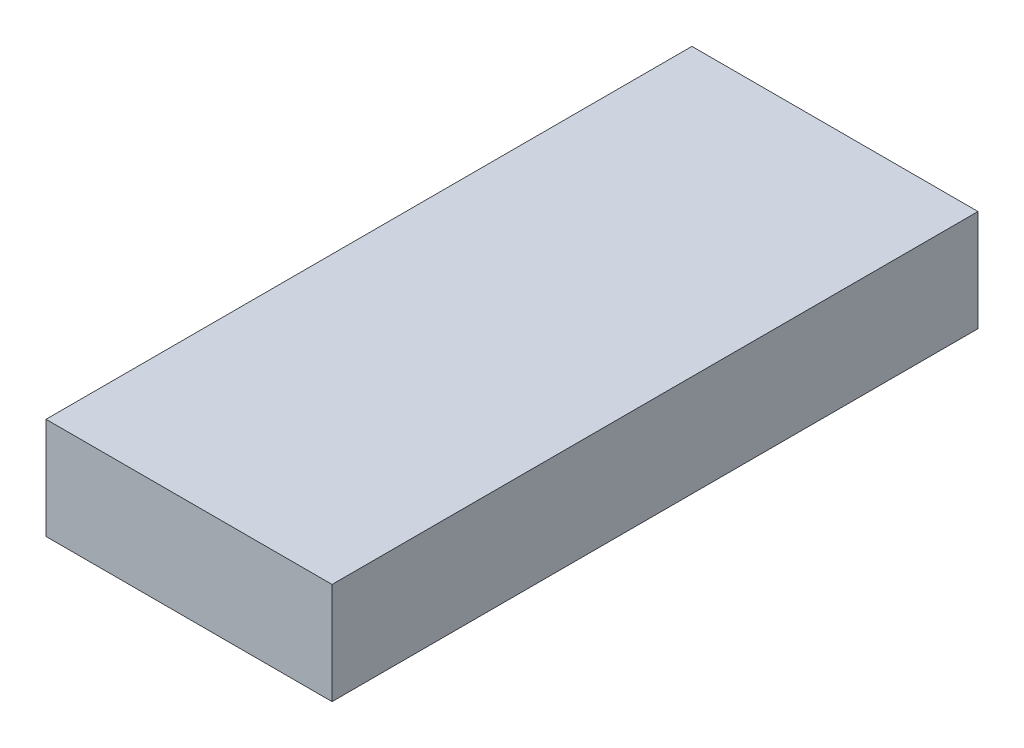
ISO-10303-21;
HEADER;
FILE_DESCRIPTION(('STEP AP214'),'2;1');
FILE_NAME('part.step','',(''),(''),'','','');
FILE_SCHEMA(('AUTOMOTIVE_DESIGN { 1 0 10303 214 1 1 1 1 }'));
ENDSEC;
DATA;
#1=APPLICATION_CONTEXT('core data for automotive mechanical design processes');
#2=APPLICATION_PROTOCOL_DEFINITION('international standard','automotive_design',2000,#1);
#3=PRODUCT_CONTEXT('',#1,'mechanical');
#4=PRODUCT('Part','Part','',(#3));
#5=PRODUCT_RELATED_PRODUCT_CATEGORY('part','',(#4));
#6=PRODUCT_DEFINITION_FORMATION('','',#4);
#7=PRODUCT_DEFINITION_CONTEXT('part definition',#1,'design');
#8=PRODUCT_DEFINITION('design','',#6,#7);
#9=PRODUCT_DEFINITION_SHAPE('','',#8);
#10=(LENGTH_UNIT() NAMED_UNIT(*) SI_UNIT(.MILLI.,.METRE.));
#11=(NAMED_UNIT(*) PLANE_ANGLE_UNIT() SI_UNIT($,.RADIAN.));
#12=(NAMED_UNIT(*) SI_UNIT($,.STERADIAN.) SOLID_ANGLE_UNIT());
#13=UNCERTAINTY_MEASURE_WITH_UNIT(LENGTH_MEASURE(1.E-05),#10,'distance_accuracy_value','');
#14=(GEOMETRIC_REPRESENTATION_CONTEXT(3) GLOBAL_UNCERTAINTY_ASSIGNED_CONTEXT((#13)) GLOBAL_UNIT_ASSIGNED_CONTEXT((#10,
#11,#12)) REPRESENTATION_CONTEXT('',''));
#15=CARTESIAN_POINT('',(0.,0.,0.));
#16=DIRECTION('',(0.,0.,1.));
#17=DIRECTION('',(1.,0.,0.));
#18=AXIS2_PLACEMENT_3D('',#15,#16,#17);
#19=CARTESIAN_POINT('',(0.,0.,70.));
#20=DIRECTION('',(-1.,0.,0.));
#21=DIRECTION('',(0.,-1.,0.));
#22=AXIS2_PLACEMENT_3D('',#19,#20,#21);
#23=PLANE('',#22);
#24=DIRECTION('',(0.,1.,0.));
#25=VECTOR('',#24,1.);
#26=CARTESIAN_POINT('',(0.,0.,0.));
#27=LINE('',#26,#25);
#28=CARTESIAN_POINT('',(0.,0.,0.));
#29=VERTEX_POINT('',#28);
#30=CARTESIAN_POINT('',(0.,11.,0.));
#31=VERTEX_POINT('',#30);
#32=EDGE_CURVE('E99',#29,#31,#27,.T.);
#33=ORIENTED_EDGE('',*,*,#32,.T.);
#34=DIRECTION('',(0.,0.,-1.));
#35=VECTOR('',#34,1.);
#36=CARTESIAN_POINT('',(0.,11.,70.));
#37=LINE('',#36,#35);
#38=CARTESIAN_POINT('',(0.,11.,70.));
#39=VERTEX_POINT('',#38);
#40=EDGE_CURVE('E11',#39,#31,#37,.T.);
#41=ORIENTED_EDGE('',*,*,#40,.F.);
#42=DIRECTION('',(0.,1.,0.));
#43=VECTOR('',#42,1.);
#44=CARTESIAN_POINT('',(0.,0.,70.));
#45=LINE('',#44,#43);
#46=CARTESIAN_POINT('',(0.,0.,70.));
#47=VERTEX_POINT('',#46);
#48=EDGE_CURVE('E87',#47,#39,#45,.T.);
#49=ORIENTED_EDGE('',*,*,#48,.F.);
#50=DIRECTION('',(0.,0.,-1.));
#51=VECTOR('',#50,1.);
#52=CARTESIAN_POINT('',(0.,0.,70.));
#53=LINE('',#52,#51);
#54=EDGE_CURVE('E95',#47,#29,#53,.T.);
#55=ORIENTED_EDGE('',*,*,#54,.T.);
#56=EDGE_LOOP('',(#33,#41,#49,#55));
#57=FACE_BOUND('',#56,.T.);
#58=ADVANCED_FACE('F36',(#57),#23,.F.);
#59=CARTESIAN_POINT('',(0.,11.,70.));
#60=DIRECTION('',(0.,-1.,0.));
#61=DIRECTION('',(1.,0.,0.));
#62=AXIS2_PLACEMENT_3D('',#59,#60,#61);
#63=PLANE('',#62);
#64=DIRECTION('',(-1.,0.,0.));
#65=VECTOR('',#64,1.);
#66=CARTESIAN_POINT('',(0.,11.,0.));
#67=LINE('',#66,#65);
#68=CARTESIAN_POINT('',(-31.,11.,0.));
#69=VERTEX_POINT('',#68);
#70=EDGE_CURVE('E91',#31,#69,#67,.T.);
#71=ORIENTED_EDGE('',*,*,#70,.T.);
#72=DIRECTION('',(0.,0.,-1.));
#73=VECTOR('',#72,1.);
#74=CARTESIAN_POINT('',(-31.,11.,70.));
#75=LINE('',#74,#73);
#76=CARTESIAN_POINT('',(-31.,11.,70.));
#77=VERTEX_POINT('',#76);
#78=EDGE_CURVE('E44',#77,#69,#75,.T.);
#79=ORIENTED_EDGE('',*,*,#78,.F.);
#80=DIRECTION('',(-1.,0.,0.));
#81=VECTOR('',#80,1.);
#82=CARTESIAN_POINT('',(0.,11.,70.));
#83=LINE('',#82,#81);
#84=EDGE_CURVE('E82',#39,#77,#83,.T.);
#85=ORIENTED_EDGE('',*,*,#84,.F.);
#86=ORIENTED_EDGE('',*,*,#40,.T.);
#87=EDGE_LOOP('',(#71,#79,#85,#86));
#88=FACE_BOUND('',#87,.T.);
#89=ADVANCED_FACE('F90',(#88),#63,.F.);
#90=CARTESIAN_POINT('',(-31.,0.,70.));
#91=DIRECTION('',(1.,0.,0.));
#92=DIRECTION('',(0.,0.,-1.));
#93=AXIS2_PLACEMENT_3D('',#90,#91,#92);
#94=PLANE('',#93);
#95=DIRECTION('',(0.,-1.,0.));
#96=VECTOR('',#95,1.);
#97=CARTESIAN_POINT('',(-31.,0.,0.));
#98=LINE('',#97,#96);
#99=CARTESIAN_POINT('',(-31.,0.,0.));
#100=VERTEX_POINT('',#99);
#101=EDGE_CURVE('E69',#69,#100,#98,.T.);
#102=ORIENTED_EDGE('',*,*,#101,.T.);
#103=DIRECTION('',(0.,0.,-1.));
#104=VECTOR('',#103,1.);
#105=CARTESIAN_POINT('',(-31.,0.,70.));
#106=LINE('',#105,#104);
#107=CARTESIAN_POINT('',(-31.,0.,70.));
#108=VERTEX_POINT('',#107);
#109=EDGE_CURVE('E92',#108,#100,#106,.T.);
#110=ORIENTED_EDGE('',*,*,#109,.F.);
#111=DIRECTION('',(0.,-1.,0.));
#112=VECTOR('',#111,1.);
#113=CARTESIAN_POINT('',(-31.,0.,70.));
#114=LINE('',#113,#112);
#115=EDGE_CURVE('E85',#77,#108,#114,.T.);
#116=ORIENTED_EDGE('',*,*,#115,.F.);
#117=ORIENTED_EDGE('',*,*,#78,.T.);
#118=EDGE_LOOP('',(#102,#110,#116,#117));
#119=FACE_BOUND('',#118,.T.);
#120=ADVANCED_FACE('F93',(#119),#94,.F.);
#121=CARTESIAN_POINT('',(0.,0.,70.));
#122=DIRECTION('',(0.,1.,0.));
#123=DIRECTION('',(-1.,0.,0.));
#124=AXIS2_PLACEMENT_3D('',#121,#122,#123);
#125=PLANE('',#124);
#126=DIRECTION('',(1.,0.,0.));
#127=VECTOR('',#126,1.);
#128=CARTESIAN_POINT('',(0.,0.,0.));
#129=LINE('',#128,#127);
#130=EDGE_CURVE('E75',#100,#29,#129,.T.);
#131=ORIENTED_EDGE('',*,*,#130,.T.);
#132=ORIENTED_EDGE('',*,*,#54,.F.);
#133=DIRECTION('',(1.,0.,0.));
#134=VECTOR('',#133,1.);
#135=CARTESIAN_POINT('',(0.,0.,70.));
#136=LINE('',#135,#134);
#137=EDGE_CURVE('E52',#108,#47,#136,.T.);
#138=ORIENTED_EDGE('',*,*,#137,.F.);
#139=ORIENTED_EDGE('',*,*,#109,.T.);
#140=EDGE_LOOP('',(#131,#132,#138,#139));
#141=FACE_BOUND('',#140,.T.);
#142=ADVANCED_FACE('F106',(#141),#125,.F.);
#143=CARTESIAN_POINT('',(0.,0.,70.));
#144=DIRECTION('',(0.,0.,1.));
#145=DIRECTION('',(1.,0.,0.));
#146=AXIS2_PLACEMENT_3D('',#143,#144,#145);
#147=PLANE('',#146);
#148=ORIENTED_EDGE('',*,*,#48,.T.);
#149=ORIENTED_EDGE('',*,*,#84,.T.);
#150=ORIENTED_EDGE('',*,*,#115,.T.);
#151=ORIENTED_EDGE('',*,*,#137,.T.);
#152=EDGE_LOOP('',(#148,#149,#150,#151));
#153=FACE_BOUND('',#152,.T.);
#154=ADVANCED_FACE('F83',(#153),#147,.T.);
#155=CARTESIAN_POINT('',(0.,0.,0.));
#156=DIRECTION('',(0.,0.,1.));
#157=DIRECTION('',(1.,0.,0.));
#158=AXIS2_PLACEMENT_3D('',#155,#156,#157);
#159=PLANE('',#158);
#160=ORIENTED_EDGE('',*,*,#32,.F.);
#161=ORIENTED_EDGE('',*,*,#130,.F.);
#162=ORIENTED_EDGE('',*,*,#101,.F.);
#163=ORIENTED_EDGE('',*,*,#70,.F.);
#164=EDGE_LOOP('',(#160,#161,#162,#163));
#165=FACE_BOUND('',#164,.T.);
#166=ADVANCED_FACE('F109',(#165),#159,.F.);
#167=CLOSED_SHELL('',(#58,#89,#120,#142,#154,#166));
#168=MANIFOLD_SOLID_BREP('B2',#167);
#169=ADVANCED_BREP_SHAPE_REPRESENTATION('',(#18,#168),#14);
#170=SHAPE_DEFINITION_REPRESENTATION(#9,#169);
ENDSEC;
END-ISO-10303-21;
